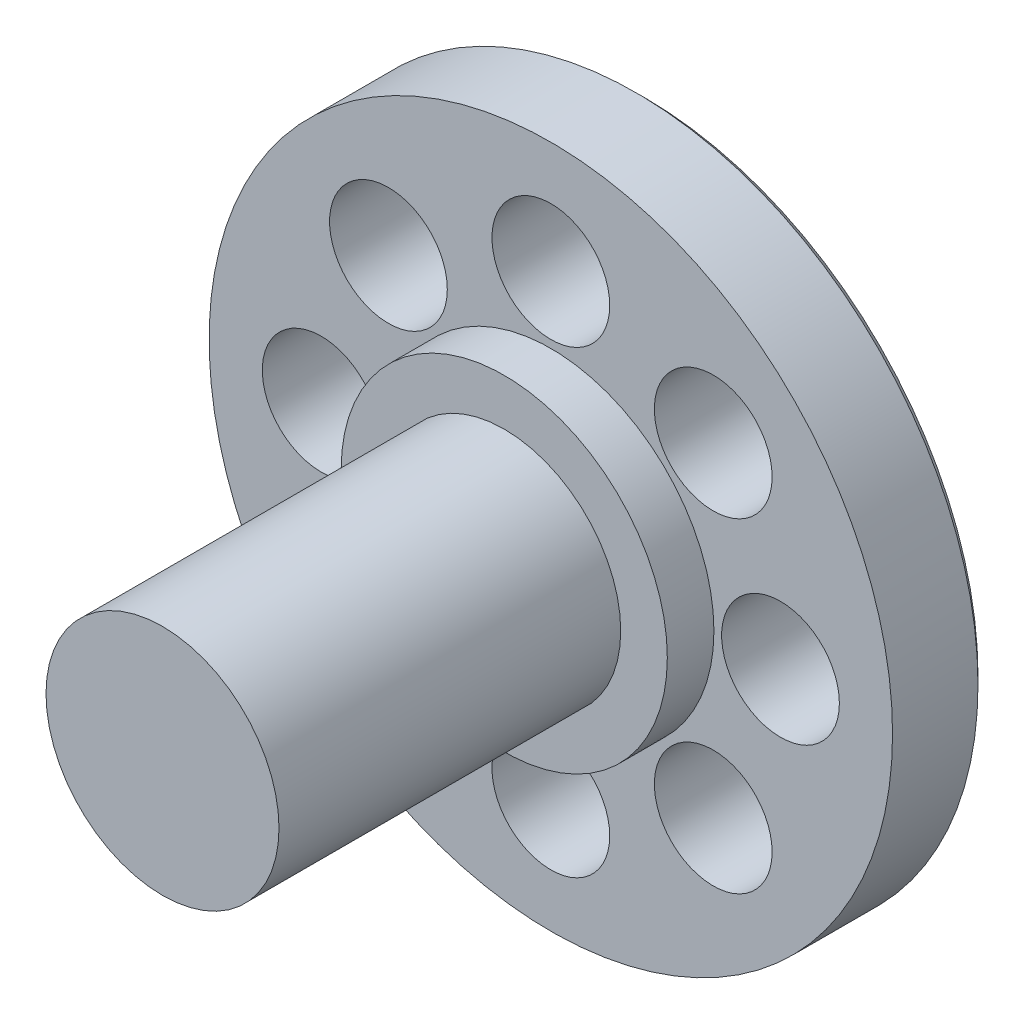
ISO-10303-21;
HEADER;
FILE_DESCRIPTION(('STEP AP214'),'2;1');
FILE_NAME('part.step','',(''),(''),'','','');
FILE_SCHEMA(('AUTOMOTIVE_DESIGN { 1 0 10303 214 1 1 1 1 }'));
ENDSEC;
DATA;
#1=APPLICATION_CONTEXT('core data for automotive mechanical design processes');
#2=APPLICATION_PROTOCOL_DEFINITION('international standard','automotive_design',2000,#1);
#3=PRODUCT_CONTEXT('',#1,'mechanical');
#4=PRODUCT('Part','Part','',(#3));
#5=PRODUCT_RELATED_PRODUCT_CATEGORY('part','',(#4));
#6=PRODUCT_DEFINITION_FORMATION('','',#4);
#7=PRODUCT_DEFINITION_CONTEXT('part definition',#1,'design');
#8=PRODUCT_DEFINITION('design','',#6,#7);
#9=PRODUCT_DEFINITION_SHAPE('','',#8);
#10=(LENGTH_UNIT() NAMED_UNIT(*) SI_UNIT(.MILLI.,.METRE.));
#11=(NAMED_UNIT(*) PLANE_ANGLE_UNIT() SI_UNIT($,.RADIAN.));
#12=(NAMED_UNIT(*) SI_UNIT($,.STERADIAN.) SOLID_ANGLE_UNIT());
#13=UNCERTAINTY_MEASURE_WITH_UNIT(LENGTH_MEASURE(1.E-05),#10,'distance_accuracy_value','');
#14=(GEOMETRIC_REPRESENTATION_CONTEXT(3) GLOBAL_UNCERTAINTY_ASSIGNED_CONTEXT((#13)) GLOBAL_UNIT_ASSIGNED_CONTEXT((#10,
#11,#12)) REPRESENTATION_CONTEXT('',''));
#15=CARTESIAN_POINT('',(0.,0.,0.));
#16=DIRECTION('',(0.,0.,1.));
#17=DIRECTION('',(1.,0.,0.));
#18=AXIS2_PLACEMENT_3D('',#15,#16,#17);
#19=CARTESIAN_POINT('',(0.,0.,31.));
#20=DIRECTION('',(0.,0.,-1.));
#21=DIRECTION('',(-1.,0.,0.));
#22=AXIS2_PLACEMENT_3D('',#19,#20,#21);
#23=CYLINDRICAL_SURFACE('',#22,10.5);
#24=CARTESIAN_POINT('',(0.,0.,6.));
#25=DIRECTION('',(0.,0.,1.));
#26=DIRECTION('',(1.,0.,0.));
#27=AXIS2_PLACEMENT_3D('',#24,#25,#26);
#28=CIRCLE('',#27,10.5);
#29=CARTESIAN_POINT('',(10.5,0.,6.));
#30=VERTEX_POINT('',#29);
#31=EDGE_CURVE('E131',#30,#30,#28,.T.);
#32=ORIENTED_EDGE('',*,*,#31,.T.);
#33=EDGE_LOOP('',(#32));
#34=FACE_BOUND('',#33,.T.);
#35=CARTESIAN_POINT('',(0.,0.,9.));
#36=DIRECTION('',(0.,0.,1.));
#37=DIRECTION('',(1.,0.,0.));
#38=AXIS2_PLACEMENT_3D('',#35,#36,#37);
#39=CIRCLE('',#38,10.5);
#40=CARTESIAN_POINT('',(10.5,0.,9.));
#41=VERTEX_POINT('',#40);
#42=EDGE_CURVE('E134',#41,#41,#39,.T.);
#43=ORIENTED_EDGE('',*,*,#42,.F.);
#44=EDGE_LOOP('',(#43));
#45=FACE_BOUND('',#44,.T.);
#46=ADVANCED_FACE('F35',(#34,#45),#23,.T.);
#47=CARTESIAN_POINT('',(0.,0.,6.));
#48=DIRECTION('',(0.,0.,1.));
#49=DIRECTION('',(1.,0.,0.));
#50=AXIS2_PLACEMENT_3D('',#47,#48,#49);
#51=PLANE('',#50);
#52=ORIENTED_EDGE('',*,*,#31,.F.);
#53=EDGE_LOOP('',(#52));
#54=FACE_BOUND('',#53,.T.);
#55=CARTESIAN_POINT('',(-14.7849999999992,-8.39524627710777E-13,6.));
#56=DIRECTION('',(0.,0.,1.));
#57=DIRECTION('',(1.,0.,0.));
#58=AXIS2_PLACEMENT_3D('',#55,#56,#57);
#59=CIRCLE('',#58,3.79);
#60=CARTESIAN_POINT('',(-10.9949999999992,-8.39524627710777E-13,6.));
#61=VERTEX_POINT('',#60);
#62=EDGE_CURVE('E125',#61,#61,#59,.T.);
#63=ORIENTED_EDGE('',*,*,#62,.F.);
#64=EDGE_LOOP('',(#63));
#65=FACE_BOUND('',#64,.T.);
#66=CARTESIAN_POINT('',(1.67542797483647E-12,-14.785,6.));
#67=DIRECTION('',(0.,0.,1.));
#68=DIRECTION('',(1.,0.,0.));
#69=AXIS2_PLACEMENT_3D('',#66,#67,#68);
#70=CIRCLE('',#69,3.79);
#71=CARTESIAN_POINT('',(3.79000000000168,-14.785,6.));
#72=VERTEX_POINT('',#71);
#73=EDGE_CURVE('E119',#72,#72,#70,.T.);
#74=ORIENTED_EDGE('',*,*,#73,.F.);
#75=EDGE_LOOP('',(#74));
#76=FACE_BOUND('',#75,.T.);
#77=CARTESIAN_POINT('',(14.7850000000008,8.37713987418237E-13,6.));
#78=DIRECTION('',(0.,0.,1.));
#79=DIRECTION('',(1.,0.,0.));
#80=AXIS2_PLACEMENT_3D('',#77,#78,#79);
#81=CIRCLE('',#80,3.79);
#82=CARTESIAN_POINT('',(18.5750000000008,8.37713987418237E-13,6.));
#83=VERTEX_POINT('',#82);
#84=EDGE_CURVE('E113',#83,#83,#81,.T.);
#85=ORIENTED_EDGE('',*,*,#84,.F.);
#86=EDGE_LOOP('',(#85));
#87=FACE_BOUND('',#86,.T.);
#88=CARTESIAN_POINT('',(0.,0.,6.));
#89=DIRECTION('',(0.,0.,1.));
#90=DIRECTION('',(1.,0.,0.));
#91=AXIS2_PLACEMENT_3D('',#88,#89,#90);
#92=CIRCLE('',#91,22.);
#93=CARTESIAN_POINT('',(22.,0.,6.));
#94=VERTEX_POINT('',#93);
#95=EDGE_CURVE('E104',#94,#94,#92,.T.);
#96=ORIENTED_EDGE('',*,*,#95,.T.);
#97=EDGE_LOOP('',(#96));
#98=FACE_BOUND('',#97,.T.);
#99=CARTESIAN_POINT('',(0.,14.785,6.));
#100=DIRECTION('',(0.,0.,1.));
#101=DIRECTION('',(1.,0.,0.));
#102=AXIS2_PLACEMENT_3D('',#99,#100,#101);
#103=CIRCLE('',#102,3.79);
#104=CARTESIAN_POINT('',(3.79,14.785,6.));
#105=VERTEX_POINT('',#104);
#106=EDGE_CURVE('E107',#105,#105,#103,.T.);
#107=ORIENTED_EDGE('',*,*,#106,.F.);
#108=EDGE_LOOP('',(#107));
#109=FACE_BOUND('',#108,.T.);
#110=CARTESIAN_POINT('',(10.4545737598433,10.4545737598437,6.));
#111=DIRECTION('',(0.,0.,1.));
#112=DIRECTION('',(1.,0.,0.));
#113=AXIS2_PLACEMENT_3D('',#110,#111,#112);
#114=CIRCLE('',#113,3.79);
#115=CARTESIAN_POINT('',(14.2445737598433,10.4545737598437,6.));
#116=VERTEX_POINT('',#115);
#117=EDGE_CURVE('E110',#116,#116,#114,.T.);
#118=ORIENTED_EDGE('',*,*,#117,.F.);
#119=EDGE_LOOP('',(#118));
#120=FACE_BOUND('',#119,.T.);
#121=CARTESIAN_POINT('',(10.4545737598445,-10.4545737598425,6.));
#122=DIRECTION('',(0.,0.,1.));
#123=DIRECTION('',(1.,0.,0.));
#124=AXIS2_PLACEMENT_3D('',#121,#122,#123);
#125=CIRCLE('',#124,3.79);
#126=CARTESIAN_POINT('',(14.2445737598445,-10.4545737598425,6.));
#127=VERTEX_POINT('',#126);
#128=EDGE_CURVE('E116',#127,#127,#125,.T.);
#129=ORIENTED_EDGE('',*,*,#128,.F.);
#130=EDGE_LOOP('',(#129));
#131=FACE_BOUND('',#130,.T.);
#132=CARTESIAN_POINT('',(-10.4545737598417,-10.4545737598437,6.));
#133=DIRECTION('',(0.,0.,1.));
#134=DIRECTION('',(1.,0.,0.));
#135=AXIS2_PLACEMENT_3D('',#132,#133,#134);
#136=CIRCLE('',#135,3.79);
#137=CARTESIAN_POINT('',(-6.66457375984168,-10.4545737598437,6.));
#138=VERTEX_POINT('',#137);
#139=EDGE_CURVE('E122',#138,#138,#136,.T.);
#140=ORIENTED_EDGE('',*,*,#139,.F.);
#141=EDGE_LOOP('',(#140));
#142=FACE_BOUND('',#141,.T.);
#143=CARTESIAN_POINT('',(-10.4545737598429,10.4545737598425,6.));
#144=DIRECTION('',(0.,0.,1.));
#145=DIRECTION('',(1.,0.,0.));
#146=AXIS2_PLACEMENT_3D('',#143,#144,#145);
#147=CIRCLE('',#146,3.79);
#148=CARTESIAN_POINT('',(-6.66457375984286,10.4545737598425,6.));
#149=VERTEX_POINT('',#148);
#150=EDGE_CURVE('E128',#149,#149,#147,.T.);
#151=ORIENTED_EDGE('',*,*,#150,.F.);
#152=EDGE_LOOP('',(#151));
#153=FACE_BOUND('',#152,.T.);
#154=ADVANCED_FACE('F168',(#54,#65,#76,#87,#98,#109,#120,#131,#142,#153),#51,.T.);
#155=CARTESIAN_POINT('',(0.,0.,0.));
#156=DIRECTION('',(0.,0.,1.));
#157=DIRECTION('',(1.,0.,0.));
#158=AXIS2_PLACEMENT_3D('',#155,#156,#157);
#159=PLANE('',#158);
#160=CARTESIAN_POINT('',(0.,0.,0.));
#161=DIRECTION('',(0.,0.,1.));
#162=DIRECTION('',(1.,0.,0.));
#163=AXIS2_PLACEMENT_3D('',#160,#161,#162);
#164=CIRCLE('',#163,6.24999999999998);
#165=CARTESIAN_POINT('',(6.24999999999998,0.,0.));
#166=VERTEX_POINT('',#165);
#167=EDGE_CURVE('E71',#166,#166,#164,.T.);
#168=ORIENTED_EDGE('',*,*,#167,.T.);
#169=EDGE_LOOP('',(#168));
#170=FACE_BOUND('',#169,.T.);
#171=CARTESIAN_POINT('',(-10.4545737598429,10.4545737598425,0.));
#172=DIRECTION('',(0.,0.,1.));
#173=DIRECTION('',(1.,0.,0.));
#174=AXIS2_PLACEMENT_3D('',#171,#172,#173);
#175=CIRCLE('',#174,4.29);
#176=CARTESIAN_POINT('',(-6.16457375984286,10.4545737598425,0.));
#177=VERTEX_POINT('',#176);
#178=EDGE_CURVE('E74',#177,#177,#175,.T.);
#179=ORIENTED_EDGE('',*,*,#178,.T.);
#180=EDGE_LOOP('',(#179));
#181=FACE_BOUND('',#180,.T.);
#182=CARTESIAN_POINT('',(-14.7849999999992,-8.39524627710777E-13,0.));
#183=DIRECTION('',(0.,0.,1.));
#184=DIRECTION('',(1.,0.,0.));
#185=AXIS2_PLACEMENT_3D('',#182,#183,#184);
#186=CIRCLE('',#185,4.29);
#187=CARTESIAN_POINT('',(-10.4949999999992,-8.39524627710777E-13,0.));
#188=VERTEX_POINT('',#187);
#189=EDGE_CURVE('E77',#188,#188,#186,.T.);
#190=ORIENTED_EDGE('',*,*,#189,.T.);
#191=EDGE_LOOP('',(#190));
#192=FACE_BOUND('',#191,.T.);
#193=CARTESIAN_POINT('',(-10.4545737598417,-10.4545737598437,0.));
#194=DIRECTION('',(0.,0.,1.));
#195=DIRECTION('',(1.,0.,0.));
#196=AXIS2_PLACEMENT_3D('',#193,#194,#195);
#197=CIRCLE('',#196,4.29000000000002);
#198=CARTESIAN_POINT('',(-6.16457375984166,-10.4545737598437,0.));
#199=VERTEX_POINT('',#198);
#200=EDGE_CURVE('E80',#199,#199,#197,.T.);
#201=ORIENTED_EDGE('',*,*,#200,.T.);
#202=EDGE_LOOP('',(#201));
#203=FACE_BOUND('',#202,.T.);
#204=CARTESIAN_POINT('',(1.67542797483647E-12,-14.785,0.));
#205=DIRECTION('',(0.,0.,1.));
#206=DIRECTION('',(1.,0.,0.));
#207=AXIS2_PLACEMENT_3D('',#204,#205,#206);
#208=CIRCLE('',#207,4.29000000000002);
#209=CARTESIAN_POINT('',(4.29000000000169,-14.785,0.));
#210=VERTEX_POINT('',#209);
#211=EDGE_CURVE('E83',#210,#210,#208,.T.);
#212=ORIENTED_EDGE('',*,*,#211,.T.);
#213=EDGE_LOOP('',(#212));
#214=FACE_BOUND('',#213,.T.);
#215=CARTESIAN_POINT('',(10.4545737598445,-10.4545737598425,0.));
#216=DIRECTION('',(0.,0.,1.));
#217=DIRECTION('',(1.,0.,0.));
#218=AXIS2_PLACEMENT_3D('',#215,#216,#217);
#219=CIRCLE('',#218,4.29000000000002);
#220=CARTESIAN_POINT('',(14.7445737598446,-10.4545737598425,0.));
#221=VERTEX_POINT('',#220);
#222=EDGE_CURVE('E86',#221,#221,#219,.T.);
#223=ORIENTED_EDGE('',*,*,#222,.T.);
#224=EDGE_LOOP('',(#223));
#225=FACE_BOUND('',#224,.T.);
#226=CARTESIAN_POINT('',(14.7850000000008,8.37713987418237E-13,0.));
#227=DIRECTION('',(0.,0.,1.));
#228=DIRECTION('',(1.,0.,0.));
#229=AXIS2_PLACEMENT_3D('',#226,#227,#228);
#230=CIRCLE('',#229,4.29);
#231=CARTESIAN_POINT('',(19.0750000000008,8.37713987418237E-13,0.));
#232=VERTEX_POINT('',#231);
#233=EDGE_CURVE('E89',#232,#232,#230,.T.);
#234=ORIENTED_EDGE('',*,*,#233,.T.);
#235=EDGE_LOOP('',(#234));
#236=FACE_BOUND('',#235,.T.);
#237=CARTESIAN_POINT('',(10.4545737598433,10.4545737598437,0.));
#238=DIRECTION('',(0.,0.,1.));
#239=DIRECTION('',(1.,0.,0.));
#240=AXIS2_PLACEMENT_3D('',#237,#238,#239);
#241=CIRCLE('',#240,4.29000000000002);
#242=CARTESIAN_POINT('',(14.7445737598434,10.4545737598437,0.));
#243=VERTEX_POINT('',#242);
#244=EDGE_CURVE('E92',#243,#243,#241,.T.);
#245=ORIENTED_EDGE('',*,*,#244,.T.);
#246=EDGE_LOOP('',(#245));
#247=FACE_BOUND('',#246,.T.);
#248=CARTESIAN_POINT('',(0.,14.785,0.));
#249=DIRECTION('',(0.,0.,1.));
#250=DIRECTION('',(1.,0.,0.));
#251=AXIS2_PLACEMENT_3D('',#248,#249,#250);
#252=CIRCLE('',#251,4.29000000000002);
#253=CARTESIAN_POINT('',(4.29000000000002,14.785,0.));
#254=VERTEX_POINT('',#253);
#255=EDGE_CURVE('E95',#254,#254,#252,.T.);
#256=ORIENTED_EDGE('',*,*,#255,.T.);
#257=EDGE_LOOP('',(#256));
#258=FACE_BOUND('',#257,.T.);
#259=CARTESIAN_POINT('',(0.,0.,0.));
#260=DIRECTION('',(0.,0.,1.));
#261=DIRECTION('',(1.,0.,0.));
#262=AXIS2_PLACEMENT_3D('',#259,#260,#261);
#263=CIRCLE('',#262,21.5);
#264=CARTESIAN_POINT('',(21.5,0.,0.));
#265=VERTEX_POINT('',#264);
#266=EDGE_CURVE('E98',#265,#265,#263,.F.);
#267=ORIENTED_EDGE('',*,*,#266,.T.);
#268=EDGE_LOOP('',(#267));
#269=FACE_BOUND('',#268,.T.);
#270=ADVANCED_FACE('F174',(#170,#181,#192,#203,#214,#225,#236,#247,#258,#269),#159,.F.);
#271=CARTESIAN_POINT('',(0.,0.,6.));
#272=DIRECTION('',(0.,0.,-1.));
#273=DIRECTION('',(-1.,0.,0.));
#274=AXIS2_PLACEMENT_3D('',#271,#272,#273);
#275=CYLINDRICAL_SURFACE('',#274,22.);
#276=CARTESIAN_POINT('',(0.,0.,0.499999999999997));
#277=DIRECTION('',(0.,0.,1.));
#278=DIRECTION('',(1.,0.,0.));
#279=AXIS2_PLACEMENT_3D('',#276,#277,#278);
#280=CIRCLE('',#279,22.);
#281=CARTESIAN_POINT('',(22.,0.,0.499999999999997));
#282=VERTEX_POINT('',#281);
#283=EDGE_CURVE('E10',#282,#282,#280,.T.);
#284=ORIENTED_EDGE('',*,*,#283,.T.);
#285=EDGE_LOOP('',(#284));
#286=FACE_BOUND('',#285,.T.);
#287=ORIENTED_EDGE('',*,*,#95,.F.);
#288=EDGE_LOOP('',(#287));
#289=FACE_BOUND('',#288,.T.);
#290=ADVANCED_FACE('F205',(#286,#289),#275,.T.);
#291=CARTESIAN_POINT('',(0.,14.785,6.));
#292=DIRECTION('',(0.,0.,-1.));
#293=DIRECTION('',(-1.,0.,0.));
#294=AXIS2_PLACEMENT_3D('',#291,#292,#293);
#295=CYLINDRICAL_SURFACE('',#294,3.79);
#296=CARTESIAN_POINT('',(0.,14.785,0.500000000000016));
#297=DIRECTION('',(0.,0.,1.));
#298=DIRECTION('',(1.,0.,0.));
#299=AXIS2_PLACEMENT_3D('',#296,#297,#298);
#300=CIRCLE('',#299,3.79);
#301=CARTESIAN_POINT('',(3.79,14.785,0.500000000000016));
#302=VERTEX_POINT('',#301);
#303=EDGE_CURVE('E43',#302,#302,#300,.F.);
#304=ORIENTED_EDGE('',*,*,#303,.T.);
#305=EDGE_LOOP('',(#304));
#306=FACE_BOUND('',#305,.T.);
#307=ORIENTED_EDGE('',*,*,#106,.T.);
#308=EDGE_LOOP('',(#307));
#309=FACE_BOUND('',#308,.T.);
#310=ADVANCED_FACE('F202',(#306,#309),#295,.F.);
#311=CARTESIAN_POINT('',(10.4545737598433,10.4545737598437,6.));
#312=DIRECTION('',(0.,0.,-1.));
#313=DIRECTION('',(-1.,0.,0.));
#314=AXIS2_PLACEMENT_3D('',#311,#312,#313);
#315=CYLINDRICAL_SURFACE('',#314,3.79);
#316=CARTESIAN_POINT('',(10.4545737598433,10.4545737598437,0.500000000000016));
#317=DIRECTION('',(0.,0.,1.));
#318=DIRECTION('',(1.,0.,0.));
#319=AXIS2_PLACEMENT_3D('',#316,#317,#318);
#320=CIRCLE('',#319,3.79);
#321=CARTESIAN_POINT('',(14.2445737598433,10.4545737598437,0.500000000000016));
#322=VERTEX_POINT('',#321);
#323=EDGE_CURVE('E47',#322,#322,#320,.F.);
#324=ORIENTED_EDGE('',*,*,#323,.T.);
#325=EDGE_LOOP('',(#324));
#326=FACE_BOUND('',#325,.T.);
#327=ORIENTED_EDGE('',*,*,#117,.T.);
#328=EDGE_LOOP('',(#327));
#329=FACE_BOUND('',#328,.T.);
#330=ADVANCED_FACE('F198',(#326,#329),#315,.F.);
#331=CARTESIAN_POINT('',(14.7850000000008,8.37713987418237E-13,6.));
#332=DIRECTION('',(0.,0.,-1.));
#333=DIRECTION('',(-1.,0.,0.));
#334=AXIS2_PLACEMENT_3D('',#331,#332,#333);
#335=CYLINDRICAL_SURFACE('',#334,3.79);
#336=CARTESIAN_POINT('',(14.7850000000008,8.37713987418237E-13,0.5));
#337=DIRECTION('',(0.,0.,1.));
#338=DIRECTION('',(1.,0.,0.));
#339=AXIS2_PLACEMENT_3D('',#336,#337,#338);
#340=CIRCLE('',#339,3.79);
#341=CARTESIAN_POINT('',(18.5750000000008,8.37713987418237E-13,0.5));
#342=VERTEX_POINT('',#341);
#343=EDGE_CURVE('E51',#342,#342,#340,.F.);
#344=ORIENTED_EDGE('',*,*,#343,.T.);
#345=EDGE_LOOP('',(#344));
#346=FACE_BOUND('',#345,.T.);
#347=ORIENTED_EDGE('',*,*,#84,.T.);
#348=EDGE_LOOP('',(#347));
#349=FACE_BOUND('',#348,.T.);
#350=ADVANCED_FACE('F194',(#346,#349),#335,.F.);
#351=CARTESIAN_POINT('',(10.4545737598445,-10.4545737598425,6.));
#352=DIRECTION('',(0.,0.,-1.));
#353=DIRECTION('',(-1.,0.,0.));
#354=AXIS2_PLACEMENT_3D('',#351,#352,#353);
#355=CYLINDRICAL_SURFACE('',#354,3.79);
#356=CARTESIAN_POINT('',(10.4545737598445,-10.4545737598425,0.500000000000016));
#357=DIRECTION('',(0.,0.,1.));
#358=DIRECTION('',(1.,0.,0.));
#359=AXIS2_PLACEMENT_3D('',#356,#357,#358);
#360=CIRCLE('',#359,3.79);
#361=CARTESIAN_POINT('',(14.2445737598445,-10.4545737598425,0.500000000000016));
#362=VERTEX_POINT('',#361);
#363=EDGE_CURVE('E56',#362,#362,#360,.F.);
#364=ORIENTED_EDGE('',*,*,#363,.T.);
#365=EDGE_LOOP('',(#364));
#366=FACE_BOUND('',#365,.T.);
#367=ORIENTED_EDGE('',*,*,#128,.T.);
#368=EDGE_LOOP('',(#367));
#369=FACE_BOUND('',#368,.T.);
#370=ADVANCED_FACE('F190',(#366,#369),#355,.F.);
#371=CARTESIAN_POINT('',(1.67542797483647E-12,-14.785,6.));
#372=DIRECTION('',(0.,0.,-1.));
#373=DIRECTION('',(-1.,0.,0.));
#374=AXIS2_PLACEMENT_3D('',#371,#372,#373);
#375=CYLINDRICAL_SURFACE('',#374,3.79);
#376=CARTESIAN_POINT('',(1.67542797483647E-12,-14.785,0.500000000000016));
#377=DIRECTION('',(0.,0.,1.));
#378=DIRECTION('',(1.,0.,0.));
#379=AXIS2_PLACEMENT_3D('',#376,#377,#378);
#380=CIRCLE('',#379,3.79);
#381=CARTESIAN_POINT('',(3.79000000000168,-14.785,0.500000000000016));
#382=VERTEX_POINT('',#381);
#383=EDGE_CURVE('E59',#382,#382,#380,.F.);
#384=ORIENTED_EDGE('',*,*,#383,.T.);
#385=EDGE_LOOP('',(#384));
#386=FACE_BOUND('',#385,.T.);
#387=ORIENTED_EDGE('',*,*,#73,.T.);
#388=EDGE_LOOP('',(#387));
#389=FACE_BOUND('',#388,.T.);
#390=ADVANCED_FACE('F186',(#386,#389),#375,.F.);
#391=CARTESIAN_POINT('',(-10.4545737598417,-10.4545737598437,6.));
#392=DIRECTION('',(0.,0.,-1.));
#393=DIRECTION('',(-1.,0.,0.));
#394=AXIS2_PLACEMENT_3D('',#391,#392,#393);
#395=CYLINDRICAL_SURFACE('',#394,3.79);
#396=CARTESIAN_POINT('',(-10.4545737598417,-10.4545737598437,0.500000000000016));
#397=DIRECTION('',(0.,0.,1.));
#398=DIRECTION('',(1.,0.,0.));
#399=AXIS2_PLACEMENT_3D('',#396,#397,#398);
#400=CIRCLE('',#399,3.79);
#401=CARTESIAN_POINT('',(-6.66457375984168,-10.4545737598437,0.500000000000016));
#402=VERTEX_POINT('',#401);
#403=EDGE_CURVE('E62',#402,#402,#400,.F.);
#404=ORIENTED_EDGE('',*,*,#403,.T.);
#405=EDGE_LOOP('',(#404));
#406=FACE_BOUND('',#405,.T.);
#407=ORIENTED_EDGE('',*,*,#139,.T.);
#408=EDGE_LOOP('',(#407));
#409=FACE_BOUND('',#408,.T.);
#410=ADVANCED_FACE('F182',(#406,#409),#395,.F.);
#411=CARTESIAN_POINT('',(-14.7849999999992,-8.39524627710777E-13,6.));
#412=DIRECTION('',(0.,0.,-1.));
#413=DIRECTION('',(-1.,0.,0.));
#414=AXIS2_PLACEMENT_3D('',#411,#412,#413);
#415=CYLINDRICAL_SURFACE('',#414,3.79);
#416=CARTESIAN_POINT('',(-14.7849999999992,-8.39524627710777E-13,0.499999999999998));
#417=DIRECTION('',(0.,0.,1.));
#418=DIRECTION('',(1.,0.,0.));
#419=AXIS2_PLACEMENT_3D('',#416,#417,#418);
#420=CIRCLE('',#419,3.79);
#421=CARTESIAN_POINT('',(-10.9949999999992,-8.39524627710777E-13,0.499999999999998));
#422=VERTEX_POINT('',#421);
#423=EDGE_CURVE('E65',#422,#422,#420,.F.);
#424=ORIENTED_EDGE('',*,*,#423,.T.);
#425=EDGE_LOOP('',(#424));
#426=FACE_BOUND('',#425,.T.);
#427=ORIENTED_EDGE('',*,*,#62,.T.);
#428=EDGE_LOOP('',(#427));
#429=FACE_BOUND('',#428,.T.);
#430=ADVANCED_FACE('F162',(#426,#429),#415,.F.);
#431=CARTESIAN_POINT('',(-10.4545737598429,10.4545737598425,6.));
#432=DIRECTION('',(0.,0.,-1.));
#433=DIRECTION('',(-1.,0.,0.));
#434=AXIS2_PLACEMENT_3D('',#431,#432,#433);
#435=CYLINDRICAL_SURFACE('',#434,3.79);
#436=CARTESIAN_POINT('',(-10.4545737598429,10.4545737598425,0.499999999999995));
#437=DIRECTION('',(0.,0.,1.));
#438=DIRECTION('',(1.,0.,0.));
#439=AXIS2_PLACEMENT_3D('',#436,#437,#438);
#440=CIRCLE('',#439,3.79);
#441=CARTESIAN_POINT('',(-6.66457375984286,10.4545737598425,0.499999999999995));
#442=VERTEX_POINT('',#441);
#443=EDGE_CURVE('E68',#442,#442,#440,.F.);
#444=ORIENTED_EDGE('',*,*,#443,.T.);
#445=EDGE_LOOP('',(#444));
#446=FACE_BOUND('',#445,.T.);
#447=ORIENTED_EDGE('',*,*,#150,.T.);
#448=EDGE_LOOP('',(#447));
#449=FACE_BOUND('',#448,.T.);
#450=ADVANCED_FACE('F152',(#446,#449),#435,.F.);
#451=CARTESIAN_POINT('',(0.,0.,31.4558441227157));
#452=DIRECTION('',(0.,0.,-1.));
#453=DIRECTION('',(-1.,0.,0.));
#454=AXIS2_PLACEMENT_3D('',#451,#452,#453);
#455=CYLINDRICAL_SURFACE('',#454,5.75);
#456=CARTESIAN_POINT('',(0.,0.,0.49999999999999));
#457=DIRECTION('',(0.,0.,1.));
#458=DIRECTION('',(1.,0.,0.));
#459=AXIS2_PLACEMENT_3D('',#456,#457,#458);
#460=CIRCLE('',#459,5.75);
#461=CARTESIAN_POINT('',(5.75,0.,0.49999999999999));
#462=VERTEX_POINT('',#461);
#463=EDGE_CURVE('E101',#462,#462,#460,.F.);
#464=ORIENTED_EDGE('',*,*,#463,.T.);
#465=EDGE_LOOP('',(#464));
#466=FACE_BOUND('',#465,.T.);
#467=CARTESIAN_POINT('',(0.,0.,8.));
#468=DIRECTION('',(0.,0.,-1.));
#469=DIRECTION('',(-1.,0.,0.));
#470=AXIS2_PLACEMENT_3D('',#467,#468,#469);
#471=CIRCLE('',#470,5.75);
#472=CARTESIAN_POINT('',(-5.75,0.,8.));
#473=VERTEX_POINT('',#472);
#474=EDGE_CURVE('E141',#473,#473,#471,.T.);
#475=ORIENTED_EDGE('',*,*,#474,.F.);
#476=EDGE_LOOP('',(#475));
#477=FACE_BOUND('',#476,.T.);
#478=ADVANCED_FACE('F149',(#466,#477),#455,.F.);
#479=CARTESIAN_POINT('',(0.,0.,0.49999999999999));
#480=DIRECTION('',(0.,0.,-1.));
#481=DIRECTION('',(-1.,0.,0.));
#482=AXIS2_PLACEMENT_3D('',#479,#480,#481);
#483=CONICAL_SURFACE('',#482,5.75,0.785398163397443);
#484=ORIENTED_EDGE('',*,*,#167,.F.);
#485=EDGE_LOOP('',(#484));
#486=FACE_BOUND('',#485,.T.);
#487=ORIENTED_EDGE('',*,*,#463,.F.);
#488=EDGE_LOOP('',(#487));
#489=FACE_BOUND('',#488,.T.);
#490=ADVANCED_FACE('F151',(#486,#489),#483,.F.);
#491=CARTESIAN_POINT('',(-10.4545737598429,10.4545737598425,0.));
#492=DIRECTION('',(0.,0.,-1.));
#493=DIRECTION('',(-1.,0.,0.));
#494=AXIS2_PLACEMENT_3D('',#491,#492,#493);
#495=CONICAL_SURFACE('',#494,4.29,0.785398163397448);
#496=ORIENTED_EDGE('',*,*,#443,.F.);
#497=EDGE_LOOP('',(#496));
#498=FACE_BOUND('',#497,.T.);
#499=ORIENTED_EDGE('',*,*,#178,.F.);
#500=EDGE_LOOP('',(#499));
#501=FACE_BOUND('',#500,.T.);
#502=ADVANCED_FACE('F159',(#498,#501),#495,.F.);
#503=CARTESIAN_POINT('',(-14.7849999999992,-8.39524627710777E-13,0.));
#504=DIRECTION('',(0.,0.,-1.));
#505=DIRECTION('',(-1.,0.,0.));
#506=AXIS2_PLACEMENT_3D('',#503,#504,#505);
#507=CONICAL_SURFACE('',#506,4.29,0.785398163397449);
#508=ORIENTED_EDGE('',*,*,#423,.F.);
#509=EDGE_LOOP('',(#508));
#510=FACE_BOUND('',#509,.T.);
#511=ORIENTED_EDGE('',*,*,#189,.F.);
#512=EDGE_LOOP('',(#511));
#513=FACE_BOUND('',#512,.T.);
#514=ADVANCED_FACE('F221',(#510,#513),#507,.F.);
#515=CARTESIAN_POINT('',(-10.4545737598417,-10.4545737598437,0.));
#516=DIRECTION('',(0.,0.,-1.));
#517=DIRECTION('',(-1.,0.,0.));
#518=AXIS2_PLACEMENT_3D('',#515,#516,#517);
#519=CONICAL_SURFACE('',#518,4.29000000000002,0.785398163397448);
#520=ORIENTED_EDGE('',*,*,#403,.F.);
#521=EDGE_LOOP('',(#520));
#522=FACE_BOUND('',#521,.T.);
#523=ORIENTED_EDGE('',*,*,#200,.F.);
#524=EDGE_LOOP('',(#523));
#525=FACE_BOUND('',#524,.T.);
#526=ADVANCED_FACE('F228',(#522,#525),#519,.F.);
#527=CARTESIAN_POINT('',(1.67542797483647E-12,-14.785,0.));
#528=DIRECTION('',(0.,0.,-1.));
#529=DIRECTION('',(-1.,0.,0.));
#530=AXIS2_PLACEMENT_3D('',#527,#528,#529);
#531=CONICAL_SURFACE('',#530,4.29000000000002,0.785398163397448);
#532=ORIENTED_EDGE('',*,*,#383,.F.);
#533=EDGE_LOOP('',(#532));
#534=FACE_BOUND('',#533,.T.);
#535=ORIENTED_EDGE('',*,*,#211,.F.);
#536=EDGE_LOOP('',(#535));
#537=FACE_BOUND('',#536,.T.);
#538=ADVANCED_FACE('F235',(#534,#537),#531,.F.);
#539=CARTESIAN_POINT('',(10.4545737598445,-10.4545737598425,0.));
#540=DIRECTION('',(0.,0.,-1.));
#541=DIRECTION('',(-1.,0.,0.));
#542=AXIS2_PLACEMENT_3D('',#539,#540,#541);
#543=CONICAL_SURFACE('',#542,4.29000000000002,0.785398163397448);
#544=ORIENTED_EDGE('',*,*,#363,.F.);
#545=EDGE_LOOP('',(#544));
#546=FACE_BOUND('',#545,.T.);
#547=ORIENTED_EDGE('',*,*,#222,.F.);
#548=EDGE_LOOP('',(#547));
#549=FACE_BOUND('',#548,.T.);
#550=ADVANCED_FACE('F242',(#546,#549),#543,.F.);
#551=CARTESIAN_POINT('',(14.7850000000008,8.37713987418237E-13,0.));
#552=DIRECTION('',(0.,0.,-1.));
#553=DIRECTION('',(-1.,0.,0.));
#554=AXIS2_PLACEMENT_3D('',#551,#552,#553);
#555=CONICAL_SURFACE('',#554,4.29,0.785398163397447);
#556=ORIENTED_EDGE('',*,*,#343,.F.);
#557=EDGE_LOOP('',(#556));
#558=FACE_BOUND('',#557,.T.);
#559=ORIENTED_EDGE('',*,*,#233,.F.);
#560=EDGE_LOOP('',(#559));
#561=FACE_BOUND('',#560,.T.);
#562=ADVANCED_FACE('F249',(#558,#561),#555,.F.);
#563=CARTESIAN_POINT('',(10.4545737598433,10.4545737598437,0.));
#564=DIRECTION('',(0.,0.,-1.));
#565=DIRECTION('',(-1.,0.,0.));
#566=AXIS2_PLACEMENT_3D('',#563,#564,#565);
#567=CONICAL_SURFACE('',#566,4.29000000000002,0.785398163397448);
#568=ORIENTED_EDGE('',*,*,#323,.F.);
#569=EDGE_LOOP('',(#568));
#570=FACE_BOUND('',#569,.T.);
#571=ORIENTED_EDGE('',*,*,#244,.F.);
#572=EDGE_LOOP('',(#571));
#573=FACE_BOUND('',#572,.T.);
#574=ADVANCED_FACE('F256',(#570,#573),#567,.F.);
#575=CARTESIAN_POINT('',(0.,14.785,0.));
#576=DIRECTION('',(0.,0.,-1.));
#577=DIRECTION('',(-1.,0.,0.));
#578=AXIS2_PLACEMENT_3D('',#575,#576,#577);
#579=CONICAL_SURFACE('',#578,4.29000000000002,0.785398163397448);
#580=ORIENTED_EDGE('',*,*,#303,.F.);
#581=EDGE_LOOP('',(#580));
#582=FACE_BOUND('',#581,.T.);
#583=ORIENTED_EDGE('',*,*,#255,.F.);
#584=EDGE_LOOP('',(#583));
#585=FACE_BOUND('',#584,.T.);
#586=ADVANCED_FACE('F262',(#582,#585),#579,.F.);
#587=CARTESIAN_POINT('',(0.,0.,0.499999999999997));
#588=DIRECTION('',(0.,0.,1.));
#589=DIRECTION('',(1.,0.,0.));
#590=AXIS2_PLACEMENT_3D('',#587,#588,#589);
#591=CONICAL_SURFACE('',#590,22.,0.785398163397445);
#592=ORIENTED_EDGE('',*,*,#266,.F.);
#593=EDGE_LOOP('',(#592));
#594=FACE_BOUND('',#593,.T.);
#595=ORIENTED_EDGE('',*,*,#283,.F.);
#596=EDGE_LOOP('',(#595));
#597=FACE_BOUND('',#596,.T.);
#598=ADVANCED_FACE('F38',(#594,#597),#591,.T.);
#599=CARTESIAN_POINT('',(0.,0.,9.));
#600=DIRECTION('',(0.,0.,1.));
#601=DIRECTION('',(1.,0.,0.));
#602=AXIS2_PLACEMENT_3D('',#599,#600,#601);
#603=PLANE('',#602);
#604=CARTESIAN_POINT('',(0.,0.,9.));
#605=DIRECTION('',(0.,0.,1.));
#606=DIRECTION('',(1.,0.,0.));
#607=AXIS2_PLACEMENT_3D('',#604,#605,#606);
#608=CIRCLE('',#607,7.5);
#609=CARTESIAN_POINT('',(7.5,0.,9.));
#610=VERTEX_POINT('',#609);
#611=EDGE_CURVE('E137',#610,#610,#608,.T.);
#612=ORIENTED_EDGE('',*,*,#611,.F.);
#613=EDGE_LOOP('',(#612));
#614=FACE_BOUND('',#613,.T.);
#615=ORIENTED_EDGE('',*,*,#42,.T.);
#616=EDGE_LOOP('',(#615));
#617=FACE_BOUND('',#616,.T.);
#618=ADVANCED_FACE('F271',(#614,#617),#603,.T.);
#619=CARTESIAN_POINT('',(0.,0.,9.));
#620=DIRECTION('',(0.,0.,1.));
#621=DIRECTION('',(1.,0.,0.));
#622=AXIS2_PLACEMENT_3D('',#619,#620,#621);
#623=CYLINDRICAL_SURFACE('',#622,7.5);
#624=ORIENTED_EDGE('',*,*,#611,.T.);
#625=EDGE_LOOP('',(#624));
#626=FACE_BOUND('',#625,.T.);
#627=CARTESIAN_POINT('',(0.,0.,31.));
#628=DIRECTION('',(0.,0.,1.));
#629=DIRECTION('',(1.,0.,0.));
#630=AXIS2_PLACEMENT_3D('',#627,#628,#629);
#631=CIRCLE('',#630,7.5);
#632=CARTESIAN_POINT('',(7.5,0.,31.));
#633=VERTEX_POINT('',#632);
#634=EDGE_CURVE('E138',#633,#633,#631,.T.);
#635=ORIENTED_EDGE('',*,*,#634,.F.);
#636=EDGE_LOOP('',(#635));
#637=FACE_BOUND('',#636,.T.);
#638=ADVANCED_FACE('F282',(#626,#637),#623,.T.);
#639=CARTESIAN_POINT('',(0.,0.,31.));
#640=DIRECTION('',(0.,0.,1.));
#641=DIRECTION('',(1.,0.,0.));
#642=AXIS2_PLACEMENT_3D('',#639,#640,#641);
#643=PLANE('',#642);
#644=ORIENTED_EDGE('',*,*,#634,.T.);
#645=EDGE_LOOP('',(#644));
#646=FACE_BOUND('',#645,.T.);
#647=ADVANCED_FACE('F178',(#646),#643,.T.);
#648=CARTESIAN_POINT('',(0.,0.,8.));
#649=DIRECTION('',(0.,0.,-1.));
#650=DIRECTION('',(-1.,0.,0.));
#651=AXIS2_PLACEMENT_3D('',#648,#649,#650);
#652=PLANE('',#651);
#653=ORIENTED_EDGE('',*,*,#474,.T.);
#654=EDGE_LOOP('',(#653));
#655=FACE_BOUND('',#654,.T.);
#656=ADVANCED_FACE('F147',(#655),#652,.T.);
#657=CLOSED_SHELL('',(#46,#154,#270,#290,#310,#330,#350,#370,#390,#410,#430,#450,#478,#490,#502,
#514,#526,#538,#550,#562,#574,#586,#598,#618,#638,#647,#656));
#658=MANIFOLD_SOLID_BREP('B2',#657);
#659=ADVANCED_BREP_SHAPE_REPRESENTATION('',(#18,#658),#14);
#660=SHAPE_DEFINITION_REPRESENTATION(#9,#659);
ENDSEC;
END-ISO-10303-21;
